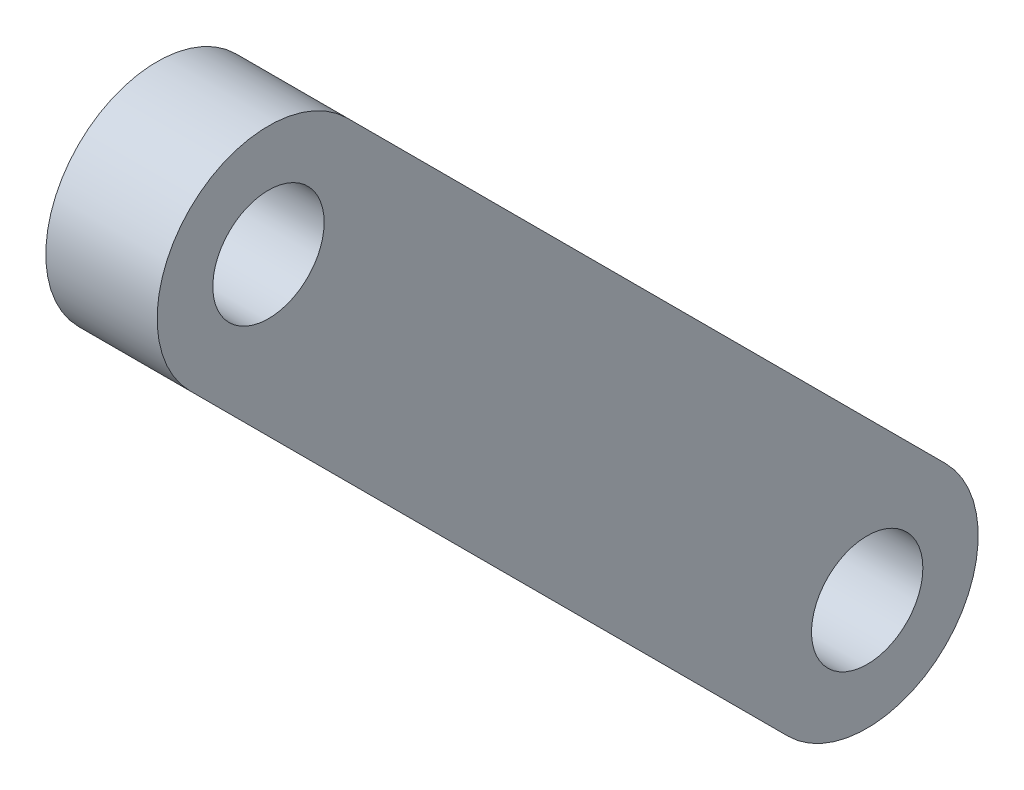
ISO-10303-21;
HEADER;
FILE_DESCRIPTION(('STEP AP214'),'2;1');
FILE_NAME('part.step','',(''),(''),'','','');
FILE_SCHEMA(('AUTOMOTIVE_DESIGN { 1 0 10303 214 1 1 1 1 }'));
ENDSEC;
DATA;
#1=APPLICATION_CONTEXT('core data for automotive mechanical design processes');
#2=APPLICATION_PROTOCOL_DEFINITION('international standard','automotive_design',2000,#1);
#3=PRODUCT_CONTEXT('',#1,'mechanical');
#4=PRODUCT('Part','Part','',(#3));
#5=PRODUCT_RELATED_PRODUCT_CATEGORY('part','',(#4));
#6=PRODUCT_DEFINITION_FORMATION('','',#4);
#7=PRODUCT_DEFINITION_CONTEXT('part definition',#1,'design');
#8=PRODUCT_DEFINITION('design','',#6,#7);
#9=PRODUCT_DEFINITION_SHAPE('','',#8);
#10=(LENGTH_UNIT() NAMED_UNIT(*) SI_UNIT(.MILLI.,.METRE.));
#11=(NAMED_UNIT(*) PLANE_ANGLE_UNIT() SI_UNIT($,.RADIAN.));
#12=(NAMED_UNIT(*) SI_UNIT($,.STERADIAN.) SOLID_ANGLE_UNIT());
#13=UNCERTAINTY_MEASURE_WITH_UNIT(LENGTH_MEASURE(1.E-05),#10,'distance_accuracy_value','');
#14=(GEOMETRIC_REPRESENTATION_CONTEXT(3) GLOBAL_UNCERTAINTY_ASSIGNED_CONTEXT((#13)) GLOBAL_UNIT_ASSIGNED_CONTEXT((#10,
#11,#12)) REPRESENTATION_CONTEXT('',''));
#15=CARTESIAN_POINT('',(0.,0.,0.));
#16=DIRECTION('',(0.,0.,1.));
#17=DIRECTION('',(1.,0.,0.));
#18=AXIS2_PLACEMENT_3D('',#15,#16,#17);
#19=CARTESIAN_POINT('',(5.,0.,-29.4384382093166));
#20=DIRECTION('',(1.,0.,0.));
#21=DIRECTION('',(0.,0.,-1.));
#22=AXIS2_PLACEMENT_3D('',#19,#20,#21);
#23=PLANE('',#22);
#24=CARTESIAN_POINT('',(5.,0.,-29.4384382093166));
#25=DIRECTION('',(1.,0.,0.));
#26=DIRECTION('',(0.,0.,-1.));
#27=AXIS2_PLACEMENT_3D('',#24,#25,#26);
#28=CIRCLE('',#27,2.49999999999997);
#29=CARTESIAN_POINT('',(5.,0.,-31.9384382093165));
#30=VERTEX_POINT('',#29);
#31=EDGE_CURVE('E104',#30,#30,#28,.T.);
#32=ORIENTED_EDGE('',*,*,#31,.F.);
#33=EDGE_LOOP('',(#32));
#34=FACE_BOUND('',#33,.T.);
#35=CARTESIAN_POINT('',(5.,0.,-29.4384382093166));
#36=DIRECTION('',(1.,0.,0.));
#37=DIRECTION('',(0.,0.,-1.));
#38=AXIS2_PLACEMENT_3D('',#35,#36,#37);
#39=CIRCLE('',#38,5.00000000000001);
#40=CARTESIAN_POINT('',(5.,3.53553390593276,-32.9739721152493));
#41=VERTEX_POINT('',#40);
#42=CARTESIAN_POINT('',(5.,-3.53553390593275,-25.9029043033838));
#43=VERTEX_POINT('',#42);
#44=EDGE_CURVE('E89',#41,#43,#39,.T.);
#45=ORIENTED_EDGE('',*,*,#44,.T.);
#46=DIRECTION('',(0.,-0.707106781186544,-0.707106781186551));
#47=VECTOR('',#46,1.);
#48=CARTESIAN_POINT('',(5.,-3.53553390593275,-25.9029043033838));
#49=LINE('',#48,#47);
#50=CARTESIAN_POINT('',(5.,-30.4055915910214,-52.7729619884727));
#51=VERTEX_POINT('',#50);
#52=EDGE_CURVE('E84',#43,#51,#49,.T.);
#53=ORIENTED_EDGE('',*,*,#52,.T.);
#54=CARTESIAN_POINT('',(5.,-26.8700576850887,-56.3084958944055));
#55=DIRECTION('',(1.,0.,0.));
#56=DIRECTION('',(0.,0.,1.));
#57=AXIS2_PLACEMENT_3D('',#54,#55,#56);
#58=CIRCLE('',#57,5.00000000000002);
#59=CARTESIAN_POINT('',(5.,-23.3345237791559,-59.8440298003382));
#60=VERTEX_POINT('',#59);
#61=EDGE_CURVE('E87',#51,#60,#58,.T.);
#62=ORIENTED_EDGE('',*,*,#61,.T.);
#63=DIRECTION('',(0.,0.707106781186543,0.707106781186552));
#64=VECTOR('',#63,1.);
#65=CARTESIAN_POINT('',(5.,3.53553390593276,-32.9739721152493));
#66=LINE('',#65,#64);
#67=EDGE_CURVE('E54',#60,#41,#66,.T.);
#68=ORIENTED_EDGE('',*,*,#67,.T.);
#69=EDGE_LOOP('',(#45,#53,#62,#68));
#70=FACE_BOUND('',#69,.T.);
#71=CARTESIAN_POINT('',(5.,-26.8850669853639,-56.3235051946808));
#72=DIRECTION('',(1.,0.,0.));
#73=DIRECTION('',(0.,0.,-1.));
#74=AXIS2_PLACEMENT_3D('',#71,#72,#73);
#75=CIRCLE('',#74,2.49999999999999);
#76=CARTESIAN_POINT('',(5.,-26.8850669853639,-58.8235051946808));
#77=VERTEX_POINT('',#76);
#78=EDGE_CURVE('E119',#77,#77,#75,.T.);
#79=ORIENTED_EDGE('',*,*,#78,.F.);
#80=EDGE_LOOP('',(#79));
#81=FACE_BOUND('',#80,.T.);
#82=ADVANCED_FACE('F37',(#34,#70,#81),#23,.T.);
#83=CARTESIAN_POINT('',(0.,0.,-29.4384382093166));
#84=DIRECTION('',(1.,0.,0.));
#85=DIRECTION('',(0.,0.,-1.));
#86=AXIS2_PLACEMENT_3D('',#83,#84,#85);
#87=PLANE('',#86);
#88=CARTESIAN_POINT('',(0.,0.,-29.4384382093166));
#89=DIRECTION('',(1.,0.,0.));
#90=DIRECTION('',(0.,0.,-1.));
#91=AXIS2_PLACEMENT_3D('',#88,#89,#90);
#92=CIRCLE('',#91,5.00000000000001);
#93=CARTESIAN_POINT('',(0.,3.53553390593276,-32.9739721152493));
#94=VERTEX_POINT('',#93);
#95=CARTESIAN_POINT('',(0.,-3.53553390593275,-25.9029043033838));
#96=VERTEX_POINT('',#95);
#97=EDGE_CURVE('E101',#94,#96,#92,.T.);
#98=ORIENTED_EDGE('',*,*,#97,.F.);
#99=DIRECTION('',(0.,0.707106781186543,0.707106781186552));
#100=VECTOR('',#99,1.);
#101=CARTESIAN_POINT('',(0.,3.53553390593276,-32.9739721152493));
#102=LINE('',#101,#100);
#103=CARTESIAN_POINT('',(0.,-23.3345237791559,-59.8440298003382));
#104=VERTEX_POINT('',#103);
#105=EDGE_CURVE('E77',#104,#94,#102,.T.);
#106=ORIENTED_EDGE('',*,*,#105,.F.);
#107=CARTESIAN_POINT('',(0.,-26.8700576850887,-56.3084958944055));
#108=DIRECTION('',(1.,0.,0.));
#109=DIRECTION('',(0.,0.,1.));
#110=AXIS2_PLACEMENT_3D('',#107,#108,#109);
#111=CIRCLE('',#110,5.00000000000002);
#112=CARTESIAN_POINT('',(0.,-30.4055915910214,-52.7729619884727));
#113=VERTEX_POINT('',#112);
#114=EDGE_CURVE('E71',#113,#104,#111,.T.);
#115=ORIENTED_EDGE('',*,*,#114,.F.);
#116=DIRECTION('',(0.,-0.707106781186544,-0.707106781186551));
#117=VECTOR('',#116,1.);
#118=CARTESIAN_POINT('',(0.,-3.53553390593275,-25.9029043033838));
#119=LINE('',#118,#117);
#120=EDGE_CURVE('E93',#96,#113,#119,.T.);
#121=ORIENTED_EDGE('',*,*,#120,.F.);
#122=EDGE_LOOP('',(#98,#106,#115,#121));
#123=FACE_BOUND('',#122,.T.);
#124=CARTESIAN_POINT('',(0.,0.,-29.4384382093166));
#125=DIRECTION('',(1.,0.,0.));
#126=DIRECTION('',(0.,0.,-1.));
#127=AXIS2_PLACEMENT_3D('',#124,#125,#126);
#128=CIRCLE('',#127,2.49999999999997);
#129=CARTESIAN_POINT('',(0.,0.,-31.9384382093165));
#130=VERTEX_POINT('',#129);
#131=EDGE_CURVE('E116',#130,#130,#128,.T.);
#132=ORIENTED_EDGE('',*,*,#131,.T.);
#133=EDGE_LOOP('',(#132));
#134=FACE_BOUND('',#133,.T.);
#135=CARTESIAN_POINT('',(0.,-26.8850669853639,-56.3235051946808));
#136=DIRECTION('',(1.,0.,0.));
#137=DIRECTION('',(0.,0.,-1.));
#138=AXIS2_PLACEMENT_3D('',#135,#136,#137);
#139=CIRCLE('',#138,2.49999999999999);
#140=CARTESIAN_POINT('',(0.,-26.8850669853639,-58.8235051946808));
#141=VERTEX_POINT('',#140);
#142=EDGE_CURVE('E122',#141,#141,#139,.T.);
#143=ORIENTED_EDGE('',*,*,#142,.T.);
#144=EDGE_LOOP('',(#143));
#145=FACE_BOUND('',#144,.T.);
#146=ADVANCED_FACE('F112',(#123,#134,#145),#87,.F.);
#147=CARTESIAN_POINT('',(5.,0.,-29.4384382093166));
#148=DIRECTION('',(-1.,0.,0.));
#149=DIRECTION('',(0.,0.,1.));
#150=AXIS2_PLACEMENT_3D('',#147,#148,#149);
#151=CYLINDRICAL_SURFACE('',#150,5.00000000000001);
#152=ORIENTED_EDGE('',*,*,#97,.T.);
#153=DIRECTION('',(-1.,0.,0.));
#154=VECTOR('',#153,1.);
#155=CARTESIAN_POINT('',(5.,-3.53553390593275,-25.9029043033838));
#156=LINE('',#155,#154);
#157=EDGE_CURVE('E11',#43,#96,#156,.T.);
#158=ORIENTED_EDGE('',*,*,#157,.F.);
#159=ORIENTED_EDGE('',*,*,#44,.F.);
#160=DIRECTION('',(-1.,0.,0.));
#161=VECTOR('',#160,1.);
#162=CARTESIAN_POINT('',(5.,3.53553390593276,-32.9739721152493));
#163=LINE('',#162,#161);
#164=EDGE_CURVE('E97',#41,#94,#163,.T.);
#165=ORIENTED_EDGE('',*,*,#164,.T.);
#166=EDGE_LOOP('',(#152,#158,#159,#165));
#167=FACE_BOUND('',#166,.T.);
#168=ADVANCED_FACE('F39',(#167),#151,.T.);
#169=CARTESIAN_POINT('',(5.,-3.53553390593275,-25.9029043033838));
#170=DIRECTION('',(0.,0.707106781186551,-0.707106781186544));
#171=DIRECTION('',(0.,0.707106781186544,0.707106781186551));
#172=AXIS2_PLACEMENT_3D('',#169,#170,#171);
#173=PLANE('',#172);
#174=ORIENTED_EDGE('',*,*,#120,.T.);
#175=DIRECTION('',(-1.,0.,0.));
#176=VECTOR('',#175,1.);
#177=CARTESIAN_POINT('',(5.,-30.4055915910214,-52.7729619884727));
#178=LINE('',#177,#176);
#179=EDGE_CURVE('E46',#51,#113,#178,.T.);
#180=ORIENTED_EDGE('',*,*,#179,.F.);
#181=ORIENTED_EDGE('',*,*,#52,.F.);
#182=ORIENTED_EDGE('',*,*,#157,.T.);
#183=EDGE_LOOP('',(#174,#180,#181,#182));
#184=FACE_BOUND('',#183,.T.);
#185=ADVANCED_FACE('F92',(#184),#173,.F.);
#186=CARTESIAN_POINT('',(5.,-26.8700576850887,-56.3084958944055));
#187=DIRECTION('',(-1.,0.,0.));
#188=DIRECTION('',(0.,0.,1.));
#189=AXIS2_PLACEMENT_3D('',#186,#187,#188);
#190=CYLINDRICAL_SURFACE('',#189,5.00000000000002);
#191=ORIENTED_EDGE('',*,*,#114,.T.);
#192=DIRECTION('',(-1.,0.,0.));
#193=VECTOR('',#192,1.);
#194=CARTESIAN_POINT('',(5.,-23.3345237791559,-59.8440298003382));
#195=LINE('',#194,#193);
#196=EDGE_CURVE('E94',#60,#104,#195,.T.);
#197=ORIENTED_EDGE('',*,*,#196,.F.);
#198=ORIENTED_EDGE('',*,*,#61,.F.);
#199=ORIENTED_EDGE('',*,*,#179,.T.);
#200=EDGE_LOOP('',(#191,#197,#198,#199));
#201=FACE_BOUND('',#200,.T.);
#202=ADVANCED_FACE('F95',(#201),#190,.T.);
#203=CARTESIAN_POINT('',(5.,3.53553390593276,-32.9739721152493));
#204=DIRECTION('',(0.,-0.707106781186552,0.707106781186543));
#205=DIRECTION('',(0.,-0.707106781186543,-0.707106781186552));
#206=AXIS2_PLACEMENT_3D('',#203,#204,#205);
#207=PLANE('',#206);
#208=ORIENTED_EDGE('',*,*,#105,.T.);
#209=ORIENTED_EDGE('',*,*,#164,.F.);
#210=ORIENTED_EDGE('',*,*,#67,.F.);
#211=ORIENTED_EDGE('',*,*,#196,.T.);
#212=EDGE_LOOP('',(#208,#209,#210,#211));
#213=FACE_BOUND('',#212,.T.);
#214=ADVANCED_FACE('F109',(#213),#207,.F.);
#215=CARTESIAN_POINT('',(5.,0.,-29.4384382093166));
#216=DIRECTION('',(-1.,0.,0.));
#217=DIRECTION('',(0.,0.,1.));
#218=AXIS2_PLACEMENT_3D('',#215,#216,#217);
#219=CYLINDRICAL_SURFACE('',#218,2.49999999999997);
#220=ORIENTED_EDGE('',*,*,#31,.T.);
#221=EDGE_LOOP('',(#220));
#222=FACE_BOUND('',#221,.T.);
#223=ORIENTED_EDGE('',*,*,#131,.F.);
#224=EDGE_LOOP('',(#223));
#225=FACE_BOUND('',#224,.T.);
#226=ADVANCED_FACE('F139',(#222,#225),#219,.F.);
#227=CARTESIAN_POINT('',(5.,-26.8850669853639,-56.3235051946808));
#228=DIRECTION('',(-1.,0.,0.));
#229=DIRECTION('',(0.,0.,1.));
#230=AXIS2_PLACEMENT_3D('',#227,#228,#229);
#231=CYLINDRICAL_SURFACE('',#230,2.49999999999999);
#232=ORIENTED_EDGE('',*,*,#78,.T.);
#233=EDGE_LOOP('',(#232));
#234=FACE_BOUND('',#233,.T.);
#235=ORIENTED_EDGE('',*,*,#142,.F.);
#236=EDGE_LOOP('',(#235));
#237=FACE_BOUND('',#236,.T.);
#238=ADVANCED_FACE('F128',(#234,#237),#231,.F.);
#239=CLOSED_SHELL('',(#82,#146,#168,#185,#202,#214,#226,#238));
#240=MANIFOLD_SOLID_BREP('B2',#239);
#241=ADVANCED_BREP_SHAPE_REPRESENTATION('',(#18,#240),#14);
#242=SHAPE_DEFINITION_REPRESENTATION(#9,#241);
ENDSEC;
END-ISO-10303-21;
